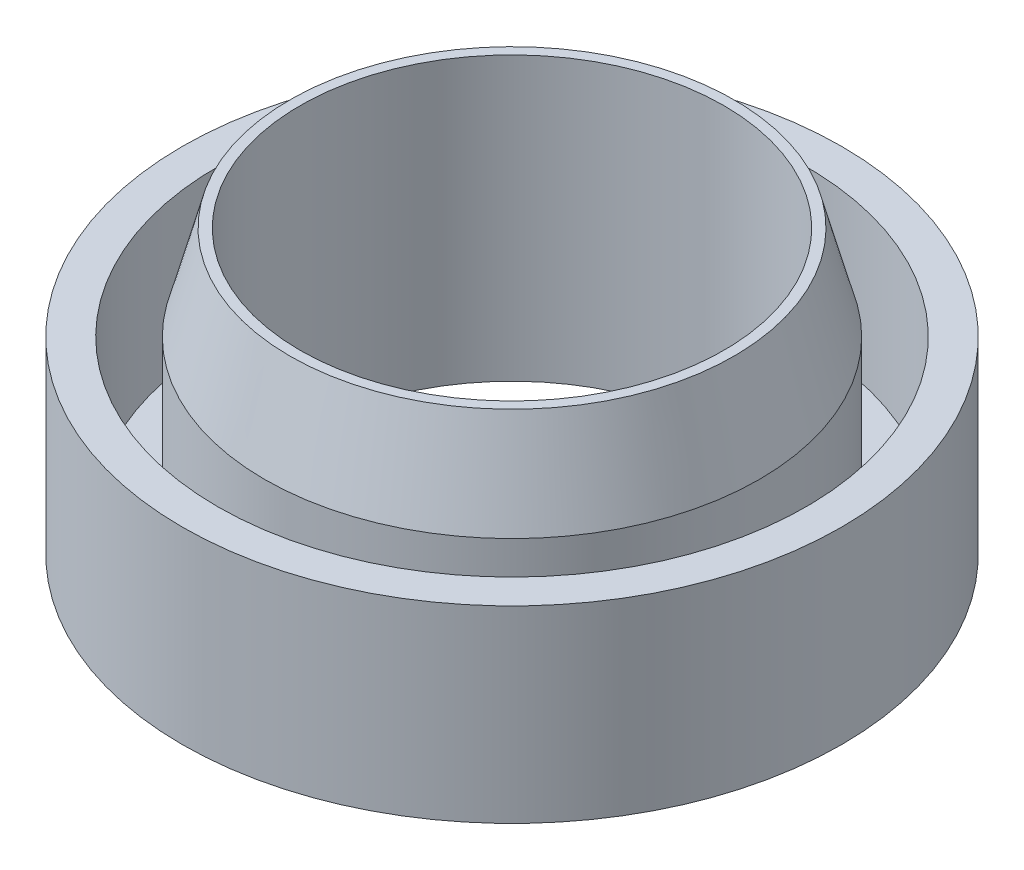
ISO-10303-21;
HEADER;
FILE_DESCRIPTION(('STEP AP214'),'2;1');
FILE_NAME('part.step','',(''),(''),'','','');
FILE_SCHEMA(('AUTOMOTIVE_DESIGN { 1 0 10303 214 1 1 1 1 }'));
ENDSEC;
DATA;
#1=APPLICATION_CONTEXT('core data for automotive mechanical design processes');
#2=APPLICATION_PROTOCOL_DEFINITION('international standard','automotive_design',2000,#1);
#3=PRODUCT_CONTEXT('',#1,'mechanical');
#4=PRODUCT('Part','Part','',(#3));
#5=PRODUCT_RELATED_PRODUCT_CATEGORY('part','',(#4));
#6=PRODUCT_DEFINITION_FORMATION('','',#4);
#7=PRODUCT_DEFINITION_CONTEXT('part definition',#1,'design');
#8=PRODUCT_DEFINITION('design','',#6,#7);
#9=PRODUCT_DEFINITION_SHAPE('','',#8);
#10=(LENGTH_UNIT() NAMED_UNIT(*) SI_UNIT(.MILLI.,.METRE.));
#11=(NAMED_UNIT(*) PLANE_ANGLE_UNIT() SI_UNIT($,.RADIAN.));
#12=(NAMED_UNIT(*) SI_UNIT($,.STERADIAN.) SOLID_ANGLE_UNIT());
#13=UNCERTAINTY_MEASURE_WITH_UNIT(LENGTH_MEASURE(1.E-05),#10,'distance_accuracy_value','');
#14=(GEOMETRIC_REPRESENTATION_CONTEXT(3) GLOBAL_UNCERTAINTY_ASSIGNED_CONTEXT((#13)) GLOBAL_UNIT_ASSIGNED_CONTEXT((#10,
#11,#12)) REPRESENTATION_CONTEXT('',''));
#15=CARTESIAN_POINT('',(0.,0.,0.));
#16=DIRECTION('',(0.,0.,1.));
#17=DIRECTION('',(1.,0.,0.));
#18=AXIS2_PLACEMENT_3D('',#15,#16,#17);
#19=CARTESIAN_POINT('',(0.,12.,0.));
#20=DIRECTION('',(0.,-1.,0.));
#21=DIRECTION('',(0.,0.,-1.));
#22=AXIS2_PLACEMENT_3D('',#19,#20,#21);
#23=CYLINDRICAL_SURFACE('',#22,14.);
#24=CARTESIAN_POINT('',(0.,0.,0.));
#25=DIRECTION('',(0.,1.,0.));
#26=DIRECTION('',(0.,0.,1.));
#27=AXIS2_PLACEMENT_3D('',#24,#25,#26);
#28=CIRCLE('',#27,14.);
#29=CARTESIAN_POINT('',(0.,0.,14.));
#30=VERTEX_POINT('',#29);
#31=EDGE_CURVE('E48',#30,#30,#28,.T.);
#32=ORIENTED_EDGE('',*,*,#31,.T.);
#33=EDGE_LOOP('',(#32));
#34=FACE_BOUND('',#33,.T.);
#35=CARTESIAN_POINT('',(0.,8.,0.));
#36=DIRECTION('',(0.,1.,0.));
#37=DIRECTION('',(0.,0.,1.));
#38=AXIS2_PLACEMENT_3D('',#35,#36,#37);
#39=CIRCLE('',#38,14.);
#40=CARTESIAN_POINT('',(0.,8.,14.));
#41=VERTEX_POINT('',#40);
#42=EDGE_CURVE('E66',#41,#41,#39,.T.);
#43=ORIENTED_EDGE('',*,*,#42,.F.);
#44=EDGE_LOOP('',(#43));
#45=FACE_BOUND('',#44,.T.);
#46=ADVANCED_FACE('F37',(#34,#45),#23,.T.);
#47=CARTESIAN_POINT('',(0.,1.5,0.));
#48=DIRECTION('',(0.,1.,0.));
#49=DIRECTION('',(0.,0.,1.));
#50=AXIS2_PLACEMENT_3D('',#47,#48,#49);
#51=CYLINDRICAL_SURFACE('',#50,12.5);
#52=CARTESIAN_POINT('',(0.,1.5,0.));
#53=DIRECTION('',(0.,1.,0.));
#54=DIRECTION('',(0.,0.,1.));
#55=AXIS2_PLACEMENT_3D('',#52,#53,#54);
#56=CIRCLE('',#55,12.5);
#57=CARTESIAN_POINT('',(0.,1.5,12.5));
#58=VERTEX_POINT('',#57);
#59=EDGE_CURVE('E60',#58,#58,#56,.T.);
#60=CARTESIAN_POINT('',(0.,8.,0.));
#61=DIRECTION('',(0.,1.,0.));
#62=DIRECTION('',(0.,0.,1.));
#63=AXIS2_PLACEMENT_3D('',#60,#61,#62);
#64=CIRCLE('',#63,12.5);
#65=CARTESIAN_POINT('',(0.,8.,12.5));
#66=VERTEX_POINT('',#65);
#67=EDGE_CURVE('E69',#66,#66,#64,.T.);
#68=CARTESIAN_POINT('',(0.,1.5,12.5));
#69=CARTESIAN_POINT('',(0.,1.56770833333333,12.5));
#70=CARTESIAN_POINT('',(0.,1.63541666666667,12.5));
#71=CARTESIAN_POINT('',(0.,1.77083333333333,12.5));
#72=CARTESIAN_POINT('',(0.,1.83854166666667,12.5));
#73=CARTESIAN_POINT('',(0.,1.97395833333333,12.5));
#74=CARTESIAN_POINT('',(0.,2.04166666666667,12.5));
#75=CARTESIAN_POINT('',(0.,2.17708333333333,12.5));
#76=CARTESIAN_POINT('',(0.,2.24479166666667,12.5));
#77=CARTESIAN_POINT('',(0.,2.38020833333333,12.5));
#78=CARTESIAN_POINT('',(0.,2.44791666666667,12.5));
#79=CARTESIAN_POINT('',(0.,2.58333333333333,12.5));
#80=CARTESIAN_POINT('',(0.,2.65104166666667,12.5));
#81=CARTESIAN_POINT('',(0.,2.78645833333333,12.5));
#82=CARTESIAN_POINT('',(0.,2.85416666666667,12.5));
#83=CARTESIAN_POINT('',(0.,2.98958333333333,12.5));
#84=CARTESIAN_POINT('',(0.,3.05729166666667,12.5));
#85=CARTESIAN_POINT('',(0.,3.19270833333333,12.5));
#86=CARTESIAN_POINT('',(0.,3.26041666666667,12.5));
#87=CARTESIAN_POINT('',(0.,3.39583333333333,12.5));
#88=CARTESIAN_POINT('',(0.,3.46354166666667,12.5));
#89=CARTESIAN_POINT('',(0.,3.59895833333333,12.5));
#90=CARTESIAN_POINT('',(0.,3.66666666666667,12.5));
#91=CARTESIAN_POINT('',(0.,3.80208333333333,12.5));
#92=CARTESIAN_POINT('',(0.,3.86979166666667,12.5));
#93=CARTESIAN_POINT('',(0.,4.00520833333333,12.5));
#94=CARTESIAN_POINT('',(0.,4.07291666666667,12.5));
#95=CARTESIAN_POINT('',(0.,4.20833333333333,12.5));
#96=CARTESIAN_POINT('',(0.,4.27604166666667,12.5));
#97=CARTESIAN_POINT('',(0.,4.41145833333333,12.5));
#98=CARTESIAN_POINT('',(0.,4.47916666666667,12.5));
#99=CARTESIAN_POINT('',(0.,4.61458333333333,12.5));
#100=CARTESIAN_POINT('',(0.,4.68229166666667,12.5));
#101=CARTESIAN_POINT('',(0.,4.81770833333333,12.5));
#102=CARTESIAN_POINT('',(0.,4.88541666666667,12.5));
#103=CARTESIAN_POINT('',(0.,5.02083333333333,12.5));
#104=CARTESIAN_POINT('',(0.,5.08854166666667,12.5));
#105=CARTESIAN_POINT('',(0.,5.22395833333333,12.5));
#106=CARTESIAN_POINT('',(0.,5.29166666666667,12.5));
#107=CARTESIAN_POINT('',(0.,5.42708333333333,12.5));
#108=CARTESIAN_POINT('',(0.,5.49479166666667,12.5));
#109=CARTESIAN_POINT('',(0.,5.63020833333333,12.5));
#110=CARTESIAN_POINT('',(0.,5.69791666666667,12.5));
#111=CARTESIAN_POINT('',(0.,5.83333333333333,12.5));
#112=CARTESIAN_POINT('',(0.,5.90104166666667,12.5));
#113=CARTESIAN_POINT('',(0.,6.03645833333333,12.5));
#114=CARTESIAN_POINT('',(0.,6.10416666666667,12.5));
#115=CARTESIAN_POINT('',(0.,6.23958333333333,12.5));
#116=CARTESIAN_POINT('',(0.,6.30729166666667,12.5));
#117=CARTESIAN_POINT('',(0.,6.44270833333333,12.5));
#118=CARTESIAN_POINT('',(0.,6.51041666666667,12.5));
#119=CARTESIAN_POINT('',(0.,6.64583333333333,12.5));
#120=CARTESIAN_POINT('',(0.,6.71354166666667,12.5));
#121=CARTESIAN_POINT('',(0.,6.84895833333333,12.5));
#122=CARTESIAN_POINT('',(0.,6.91666666666667,12.5));
#123=CARTESIAN_POINT('',(0.,7.05208333333333,12.5));
#124=CARTESIAN_POINT('',(0.,7.11979166666667,12.5));
#125=CARTESIAN_POINT('',(0.,7.25520833333333,12.5));
#126=CARTESIAN_POINT('',(0.,7.32291666666667,12.5));
#127=CARTESIAN_POINT('',(0.,7.45833333333333,12.5));
#128=CARTESIAN_POINT('',(0.,7.52604166666667,12.5));
#129=CARTESIAN_POINT('',(0.,7.66145833333333,12.5));
#130=CARTESIAN_POINT('',(0.,7.72916666666667,12.5));
#131=CARTESIAN_POINT('',(0.,7.86458333333333,12.5));
#132=CARTESIAN_POINT('',(0.,7.93229166666667,12.5));
#133=CARTESIAN_POINT('',(0.,8.,12.5));
#134=B_SPLINE_CURVE_WITH_KNOTS('',3,(#68,#69,#70,#71,#72,#73,#74,#75,#76,#77,#78,#79,#80,#81,
#82,#83,#84,#85,#86,#87,#88,#89,#90,#91,#92,#93,#94,#95,#96,#97,#98,#99,#100,#101,#102,#103,
#104,#105,#106,#107,#108,#109,#110,#111,#112,#113,#114,#115,#116,#117,#118,#119,#120,#121,#122,
#123,#124,#125,#126,#127,#128,#129,#130,#131,#132,#133),.UNSPECIFIED.,.F.,.F.,(4,2,2,2,2,2,2,2,
2,2,2,2,2,2,2,2,2,2,2,2,2,2,2,2,2,2,2,2,2,2,2,2,4),(0.,0.203125,0.40625,0.609375,0.8125,
1.015625,1.21875,1.421875,1.625,1.828125,2.03125,2.234375,2.4375,2.640625,2.84375,3.046875,3.25,
3.453125,3.65625,3.859375,4.0625,4.265625,4.46875,4.671875,4.875,5.078125,5.28125,5.484375,
5.6875,5.890625,6.09375,6.296875,6.5),.UNSPECIFIED.);
#135=EDGE_CURVE('BSEAM73',#58,#66,#134,.T.);
#136=ORIENTED_EDGE('',*,*,#59,.F.);
#137=ORIENTED_EDGE('',*,*,#67,.T.);
#138=ORIENTED_EDGE('',*,*,#135,.T.);
#139=ORIENTED_EDGE('',*,*,#135,.F.);
#140=EDGE_LOOP('',(#136,#138,#137,#139));
#141=FACE_BOUND('',#140,.T.);
#142=ADVANCED_FACE('F73',(#141),#51,.F.);
#143=CARTESIAN_POINT('',(0.,12.,0.));
#144=DIRECTION('',(0.,1.,0.));
#145=DIRECTION('',(0.,0.,1.));
#146=AXIS2_PLACEMENT_3D('',#143,#144,#145);
#147=PLANE('',#146);
#148=CARTESIAN_POINT('',(0.,12.,0.));
#149=DIRECTION('',(0.,1.,0.));
#150=DIRECTION('',(0.,0.,1.));
#151=AXIS2_PLACEMENT_3D('',#148,#149,#150);
#152=CIRCLE('',#151,9.42820323027555);
#153=CARTESIAN_POINT('',(0.,12.,9.42820323027555));
#154=VERTEX_POINT('',#153);
#155=EDGE_CURVE('E44',#154,#154,#152,.T.);
#156=ORIENTED_EDGE('',*,*,#155,.T.);
#157=EDGE_LOOP('',(#156));
#158=FACE_BOUND('',#157,.T.);
#159=CARTESIAN_POINT('',(0.,12.,0.));
#160=DIRECTION('',(0.,1.,0.));
#161=DIRECTION('',(0.,0.,1.));
#162=AXIS2_PLACEMENT_3D('',#159,#160,#161);
#163=CIRCLE('',#162,9.);
#164=CARTESIAN_POINT('',(0.,12.,9.));
#165=VERTEX_POINT('',#164);
#166=EDGE_CURVE('E57',#165,#165,#163,.T.);
#167=ORIENTED_EDGE('',*,*,#166,.F.);
#168=EDGE_LOOP('',(#167));
#169=FACE_BOUND('',#168,.T.);
#170=ADVANCED_FACE('F88',(#158,#169),#147,.T.);
#171=CARTESIAN_POINT('',(0.,0.,0.));
#172=DIRECTION('',(0.,1.,0.));
#173=DIRECTION('',(0.,0.,1.));
#174=AXIS2_PLACEMENT_3D('',#171,#172,#173);
#175=PLANE('',#174);
#176=CARTESIAN_POINT('',(0.,0.,0.));
#177=DIRECTION('',(0.,1.,0.));
#178=DIRECTION('',(0.,0.,1.));
#179=AXIS2_PLACEMENT_3D('',#176,#177,#178);
#180=CIRCLE('',#179,9.);
#181=CARTESIAN_POINT('',(0.,0.,9.));
#182=VERTEX_POINT('',#181);
#183=EDGE_CURVE('E52',#182,#182,#180,.F.);
#184=ORIENTED_EDGE('',*,*,#183,.F.);
#185=EDGE_LOOP('',(#184));
#186=FACE_BOUND('',#185,.T.);
#187=ORIENTED_EDGE('',*,*,#31,.F.);
#188=EDGE_LOOP('',(#187));
#189=FACE_BOUND('',#188,.T.);
#190=ADVANCED_FACE('F92',(#186,#189),#175,.F.);
#191=CARTESIAN_POINT('',(0.,-0.000999999999999265,0.));
#192=DIRECTION('',(0.,1.,0.));
#193=DIRECTION('',(0.,0.,1.));
#194=AXIS2_PLACEMENT_3D('',#191,#192,#193);
#195=CYLINDRICAL_SURFACE('',#194,9.);
#196=ORIENTED_EDGE('',*,*,#166,.T.);
#197=EDGE_LOOP('',(#196));
#198=FACE_BOUND('',#197,.T.);
#199=ORIENTED_EDGE('',*,*,#183,.T.);
#200=EDGE_LOOP('',(#199));
#201=FACE_BOUND('',#200,.T.);
#202=ADVANCED_FACE('F95',(#198,#201),#195,.F.);
#203=CARTESIAN_POINT('',(0.,1.5,0.));
#204=DIRECTION('',(0.,1.,0.));
#205=DIRECTION('',(0.,0.,1.));
#206=AXIS2_PLACEMENT_3D('',#203,#204,#205);
#207=PLANE('',#206);
#208=CARTESIAN_POINT('',(0.,1.5,0.));
#209=DIRECTION('',(0.,1.,0.));
#210=DIRECTION('',(0.,0.,1.));
#211=AXIS2_PLACEMENT_3D('',#208,#209,#210);
#212=CIRCLE('',#211,10.5);
#213=CARTESIAN_POINT('',(0.,1.5,10.5));
#214=VERTEX_POINT('',#213);
#215=EDGE_CURVE('E63',#214,#214,#212,.T.);
#216=ORIENTED_EDGE('',*,*,#215,.F.);
#217=EDGE_LOOP('',(#216));
#218=FACE_BOUND('',#217,.T.);
#219=ORIENTED_EDGE('',*,*,#59,.T.);
#220=EDGE_LOOP('',(#219));
#221=FACE_BOUND('',#220,.T.);
#222=ADVANCED_FACE('F100',(#218,#221),#207,.T.);
#223=CARTESIAN_POINT('',(0.,1.5,0.));
#224=DIRECTION('',(0.,1.,0.));
#225=DIRECTION('',(0.,0.,1.));
#226=AXIS2_PLACEMENT_3D('',#223,#224,#225);
#227=CYLINDRICAL_SURFACE('',#226,10.5);
#228=CARTESIAN_POINT('',(0.,8.0000000000001,0.));
#229=DIRECTION('',(0.,1.,0.));
#230=DIRECTION('',(0.,0.,1.));
#231=AXIS2_PLACEMENT_3D('',#228,#229,#230);
#232=CIRCLE('',#231,10.5);
#233=CARTESIAN_POINT('',(0.,8.0000000000001,10.5));
#234=VERTEX_POINT('',#233);
#235=EDGE_CURVE('E10',#234,#234,#232,.F.);
#236=CARTESIAN_POINT('',(0.,8.0000000000001,10.5));
#237=CARTESIAN_POINT('',(0.,7.93229166666677,10.5));
#238=CARTESIAN_POINT('',(0.,7.86458333333343,10.5));
#239=CARTESIAN_POINT('',(0.,7.72916666666676,10.5));
#240=CARTESIAN_POINT('',(0.,7.66145833333343,10.5));
#241=CARTESIAN_POINT('',(0.,7.52604166666676,10.5));
#242=CARTESIAN_POINT('',(0.,7.45833333333343,10.5));
#243=CARTESIAN_POINT('',(0.,7.32291666666676,10.5));
#244=CARTESIAN_POINT('',(0.,7.25520833333342,10.5));
#245=CARTESIAN_POINT('',(0.,7.11979166666675,10.5));
#246=CARTESIAN_POINT('',(0.,7.05208333333342,10.5));
#247=CARTESIAN_POINT('',(0.,6.91666666666675,10.5));
#248=CARTESIAN_POINT('',(0.,6.84895833333342,10.5));
#249=CARTESIAN_POINT('',(0.,6.71354166666675,10.5));
#250=CARTESIAN_POINT('',(0.,6.64583333333341,10.5));
#251=CARTESIAN_POINT('',(0.,6.51041666666674,10.5));
#252=CARTESIAN_POINT('',(0.,6.44270833333341,10.5));
#253=CARTESIAN_POINT('',(0.,6.30729166666674,10.5));
#254=CARTESIAN_POINT('',(0.,6.23958333333341,10.5));
#255=CARTESIAN_POINT('',(0.,6.10416666666674,10.5));
#256=CARTESIAN_POINT('',(0.,6.0364583333334,10.5));
#257=CARTESIAN_POINT('',(0.,5.90104166666673,10.5));
#258=CARTESIAN_POINT('',(0.,5.8333333333334,10.5));
#259=CARTESIAN_POINT('',(0.,5.69791666666673,10.5));
#260=CARTESIAN_POINT('',(0.,5.6302083333334,10.5));
#261=CARTESIAN_POINT('',(0.,5.49479166666673,10.5));
#262=CARTESIAN_POINT('',(0.,5.42708333333339,10.5));
#263=CARTESIAN_POINT('',(0.,5.29166666666672,10.5));
#264=CARTESIAN_POINT('',(0.,5.22395833333339,10.5));
#265=CARTESIAN_POINT('',(0.,5.08854166666672,10.5));
#266=CARTESIAN_POINT('',(0.,5.02083333333339,10.5));
#267=CARTESIAN_POINT('',(0.,4.88541666666672,10.5));
#268=CARTESIAN_POINT('',(0.,4.81770833333338,10.5));
#269=CARTESIAN_POINT('',(0.,4.68229166666671,10.5));
#270=CARTESIAN_POINT('',(0.,4.61458333333338,10.5));
#271=CARTESIAN_POINT('',(0.,4.47916666666671,10.5));
#272=CARTESIAN_POINT('',(0.,4.41145833333338,10.5));
#273=CARTESIAN_POINT('',(0.,4.27604166666671,10.5));
#274=CARTESIAN_POINT('',(0.,4.20833333333337,10.5));
#275=CARTESIAN_POINT('',(0.,4.07291666666671,10.5));
#276=CARTESIAN_POINT('',(0.,4.00520833333337,10.5));
#277=CARTESIAN_POINT('',(0.,3.8697916666667,10.5));
#278=CARTESIAN_POINT('',(0.,3.80208333333337,10.5));
#279=CARTESIAN_POINT('',(0.,3.6666666666667,10.5));
#280=CARTESIAN_POINT('',(0.,3.59895833333337,10.5));
#281=CARTESIAN_POINT('',(0.,3.4635416666667,10.5));
#282=CARTESIAN_POINT('',(0.,3.39583333333336,10.5));
#283=CARTESIAN_POINT('',(0.,3.26041666666669,10.5));
#284=CARTESIAN_POINT('',(0.,3.19270833333336,10.5));
#285=CARTESIAN_POINT('',(0.,3.05729166666669,10.5));
#286=CARTESIAN_POINT('',(0.,2.98958333333336,10.5));
#287=CARTESIAN_POINT('',(0.,2.85416666666669,10.5));
#288=CARTESIAN_POINT('',(0.,2.78645833333335,10.5));
#289=CARTESIAN_POINT('',(0.,2.65104166666668,10.5));
#290=CARTESIAN_POINT('',(0.,2.58333333333335,10.5));
#291=CARTESIAN_POINT('',(0.,2.44791666666668,10.5));
#292=CARTESIAN_POINT('',(0.,2.38020833333335,10.5));
#293=CARTESIAN_POINT('',(0.,2.24479166666668,10.5));
#294=CARTESIAN_POINT('',(0.,2.17708333333334,10.5));
#295=CARTESIAN_POINT('',(0.,2.04166666666667,10.5));
#296=CARTESIAN_POINT('',(0.,1.97395833333334,10.5));
#297=CARTESIAN_POINT('',(0.,1.83854166666667,10.5));
#298=CARTESIAN_POINT('',(0.,1.77083333333334,10.5));
#299=CARTESIAN_POINT('',(0.,1.63541666666667,10.5));
#300=CARTESIAN_POINT('',(0.,1.56770833333333,10.5));
#301=CARTESIAN_POINT('',(0.,1.5,10.5));
#302=B_SPLINE_CURVE_WITH_KNOTS('',3,(#236,#237,#238,#239,#240,#241,#242,#243,#244,#245,#246,
#247,#248,#249,#250,#251,#252,#253,#254,#255,#256,#257,#258,#259,#260,#261,#262,#263,#264,#265,
#266,#267,#268,#269,#270,#271,#272,#273,#274,#275,#276,#277,#278,#279,#280,#281,#282,#283,#284,
#285,#286,#287,#288,#289,#290,#291,#292,#293,#294,#295,#296,#297,#298,#299,#300,#301),
.UNSPECIFIED.,.F.,.F.,(4,2,2,2,2,2,2,2,2,2,2,2,2,2,2,2,2,2,2,2,2,2,2,2,2,2,2,2,2,2,2,2,4),(0.,
0.203125000000004,0.406250000000007,0.60937500000001,0.812500000000014,1.01562500000002,
1.21875000000002,1.42187500000002,1.62500000000003,1.82812500000003,2.03125000000003,
2.23437500000004,2.43750000000004,2.64062500000004,2.84375000000004,3.04687500000005,
3.25000000000005,3.45312500000005,3.65625000000006,3.85937500000006,4.06250000000006,
4.26562500000007,4.46875000000007,4.67187500000007,4.87500000000007,5.07812500000008,
5.28125000000008,5.48437500000008,5.68750000000009,5.89062500000009,6.09375000000009,
6.2968750000001,6.5000000000001),.UNSPECIFIED.);
#303=EDGE_CURVE('BSEAM78',#234,#214,#302,.T.);
#304=ORIENTED_EDGE('',*,*,#235,.T.);
#305=ORIENTED_EDGE('',*,*,#215,.T.);
#306=ORIENTED_EDGE('',*,*,#303,.T.);
#307=ORIENTED_EDGE('',*,*,#303,.F.);
#308=EDGE_LOOP('',(#304,#306,#305,#307));
#309=FACE_BOUND('',#308,.T.);
#310=ADVANCED_FACE('F78',(#309),#227,.T.);
#311=CARTESIAN_POINT('',(0.,8.,0.));
#312=DIRECTION('',(0.,1.,0.));
#313=DIRECTION('',(0.,0.,1.));
#314=AXIS2_PLACEMENT_3D('',#311,#312,#313);
#315=PLANE('',#314);
#316=ORIENTED_EDGE('',*,*,#67,.F.);
#317=EDGE_LOOP('',(#316));
#318=FACE_BOUND('',#317,.T.);
#319=ORIENTED_EDGE('',*,*,#42,.T.);
#320=EDGE_LOOP('',(#319));
#321=FACE_BOUND('',#320,.T.);
#322=ADVANCED_FACE('F75',(#318,#321),#315,.T.);
#323=CARTESIAN_POINT('',(0.,12.,0.));
#324=DIRECTION('',(0.,-1.,0.));
#325=DIRECTION('',(0.,0.,-1.));
#326=AXIS2_PLACEMENT_3D('',#323,#324,#325);
#327=CONICAL_SURFACE('',#326,9.42820323027555,0.261799387799147);
#328=ORIENTED_EDGE('',*,*,#235,.F.);
#329=EDGE_LOOP('',(#328));
#330=FACE_BOUND('',#329,.T.);
#331=ORIENTED_EDGE('',*,*,#155,.F.);
#332=EDGE_LOOP('',(#331));
#333=FACE_BOUND('',#332,.T.);
#334=ADVANCED_FACE('F39',(#330,#333),#327,.T.);
#335=CLOSED_SHELL('',(#46,#142,#170,#190,#202,#222,#310,#322,#334));
#336=MANIFOLD_SOLID_BREP('B2',#335);
#337=ADVANCED_BREP_SHAPE_REPRESENTATION('',(#18,#336),#14);
#338=SHAPE_DEFINITION_REPRESENTATION(#9,#337);
ENDSEC;
END-ISO-10303-21;
